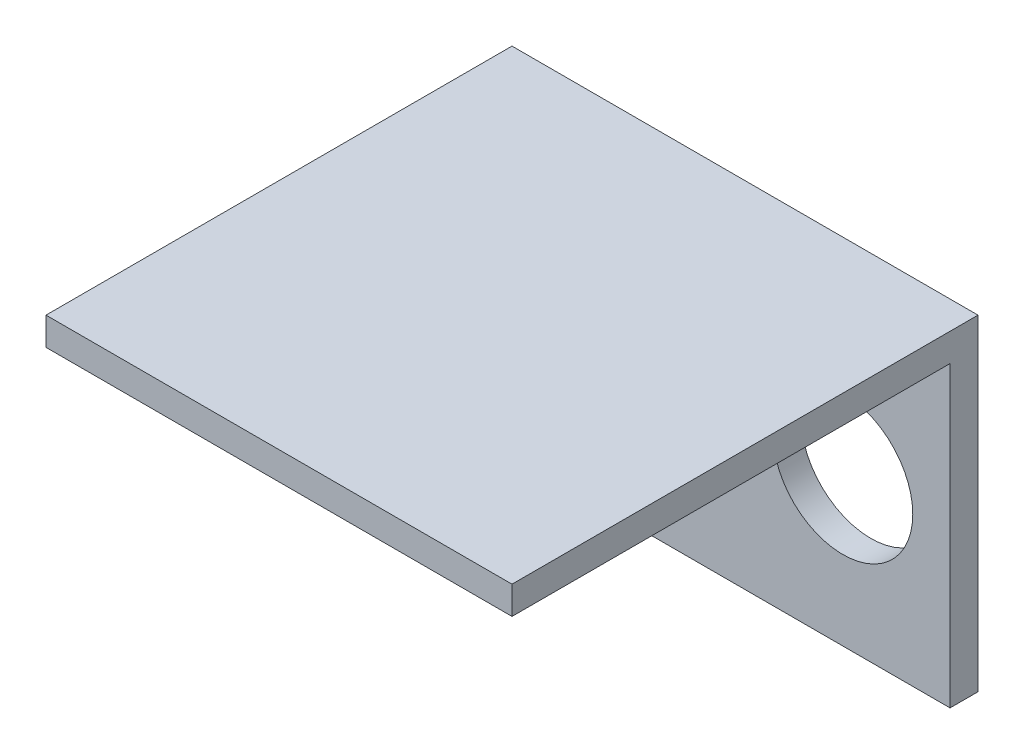
ISO-10303-21;
HEADER;
FILE_DESCRIPTION(('STEP AP214'),'2;1');
FILE_NAME('part.step','',(''),(''),'','','');
FILE_SCHEMA(('AUTOMOTIVE_DESIGN { 1 0 10303 214 1 1 1 1 }'));
ENDSEC;
DATA;
#1=APPLICATION_CONTEXT('core data for automotive mechanical design processes');
#2=APPLICATION_PROTOCOL_DEFINITION('international standard','automotive_design',2000,#1);
#3=PRODUCT_CONTEXT('',#1,'mechanical');
#4=PRODUCT('Part','Part','',(#3));
#5=PRODUCT_RELATED_PRODUCT_CATEGORY('part','',(#4));
#6=PRODUCT_DEFINITION_FORMATION('','',#4);
#7=PRODUCT_DEFINITION_CONTEXT('part definition',#1,'design');
#8=PRODUCT_DEFINITION('design','',#6,#7);
#9=PRODUCT_DEFINITION_SHAPE('','',#8);
#10=(LENGTH_UNIT() NAMED_UNIT(*) SI_UNIT(.MILLI.,.METRE.));
#11=(NAMED_UNIT(*) PLANE_ANGLE_UNIT() SI_UNIT($,.RADIAN.));
#12=(NAMED_UNIT(*) SI_UNIT($,.STERADIAN.) SOLID_ANGLE_UNIT());
#13=UNCERTAINTY_MEASURE_WITH_UNIT(LENGTH_MEASURE(1.E-05),#10,'distance_accuracy_value','');
#14=(GEOMETRIC_REPRESENTATION_CONTEXT(3) GLOBAL_UNCERTAINTY_ASSIGNED_CONTEXT((#13)) GLOBAL_UNIT_ASSIGNED_CONTEXT((#10,
#11,#12)) REPRESENTATION_CONTEXT('',''));
#15=CARTESIAN_POINT('',(0.,0.,0.));
#16=DIRECTION('',(0.,0.,1.));
#17=DIRECTION('',(1.,0.,0.));
#18=AXIS2_PLACEMENT_3D('',#15,#16,#17);
#19=CARTESIAN_POINT('',(-37.8760741653025,3.,39.1832679415775));
#20=DIRECTION('',(1.,0.,0.));
#21=DIRECTION('',(0.,0.,-1.));
#22=AXIS2_PLACEMENT_3D('',#19,#20,#21);
#23=PLANE('',#22);
#24=DIRECTION('',(0.,-1.,0.));
#25=VECTOR('',#24,1.);
#26=CARTESIAN_POINT('',(-37.8760741653025,3.,-10.8167320584225));
#27=LINE('',#26,#25);
#28=CARTESIAN_POINT('',(-37.8760741653025,3.,-10.8167320584225));
#29=VERTEX_POINT('',#28);
#30=CARTESIAN_POINT('',(-37.8760741653025,-32.,-10.8167320584225));
#31=VERTEX_POINT('',#30);
#32=EDGE_CURVE('E143',#29,#31,#27,.T.);
#33=ORIENTED_EDGE('',*,*,#32,.T.);
#34=DIRECTION('',(0.,0.,-1.));
#35=VECTOR('',#34,1.);
#36=CARTESIAN_POINT('',(-37.8760741653025,-32.,-10.8167320584225));
#37=LINE('',#36,#35);
#38=CARTESIAN_POINT('',(-37.8760741653025,-32.,-7.8167320584225));
#39=VERTEX_POINT('',#38);
#40=EDGE_CURVE('E111',#39,#31,#37,.T.);
#41=ORIENTED_EDGE('',*,*,#40,.F.);
#42=DIRECTION('',(0.,1.,0.));
#43=VECTOR('',#42,1.);
#44=CARTESIAN_POINT('',(-37.8760741653025,-32.,-7.8167320584225));
#45=LINE('',#44,#43);
#46=CARTESIAN_POINT('',(-37.8760741653025,0.,-7.8167320584225));
#47=VERTEX_POINT('',#46);
#48=EDGE_CURVE('E106',#39,#47,#45,.T.);
#49=ORIENTED_EDGE('',*,*,#48,.T.);
#50=DIRECTION('',(0.,0.,1.));
#51=VECTOR('',#50,1.);
#52=CARTESIAN_POINT('',(-37.8760741653025,0.,39.1832679415775));
#53=LINE('',#52,#51);
#54=CARTESIAN_POINT('',(-37.8760741653025,0.,39.1832679415775));
#55=VERTEX_POINT('',#54);
#56=EDGE_CURVE('E126',#47,#55,#53,.T.);
#57=ORIENTED_EDGE('',*,*,#56,.T.);
#58=DIRECTION('',(0.,-1.,0.));
#59=VECTOR('',#58,1.);
#60=CARTESIAN_POINT('',(-37.8760741653025,3.,39.1832679415775));
#61=LINE('',#60,#59);
#62=CARTESIAN_POINT('',(-37.8760741653025,3.,39.1832679415775));
#63=VERTEX_POINT('',#62);
#64=EDGE_CURVE('E11',#63,#55,#61,.T.);
#65=ORIENTED_EDGE('',*,*,#64,.F.);
#66=DIRECTION('',(0.,0.,1.));
#67=VECTOR('',#66,1.);
#68=CARTESIAN_POINT('',(-37.8760741653025,3.,39.1832679415775));
#69=LINE('',#68,#67);
#70=EDGE_CURVE('E134',#29,#63,#69,.T.);
#71=ORIENTED_EDGE('',*,*,#70,.F.);
#72=EDGE_LOOP('',(#33,#41,#49,#57,#65,#71));
#73=FACE_BOUND('',#72,.T.);
#74=ADVANCED_FACE('F39',(#73),#23,.F.);
#75=CARTESIAN_POINT('',(-37.8760741653025,3.,39.1832679415775));
#76=DIRECTION('',(0.,0.,-1.));
#77=DIRECTION('',(-1.,0.,0.));
#78=AXIS2_PLACEMENT_3D('',#75,#76,#77);
#79=PLANE('',#78);
#80=DIRECTION('',(1.,0.,0.));
#81=VECTOR('',#80,1.);
#82=CARTESIAN_POINT('',(-37.8760741653025,0.,39.1832679415775));
#83=LINE('',#82,#81);
#84=CARTESIAN_POINT('',(12.1239258346975,0.,39.1832679415775));
#85=VERTEX_POINT('',#84);
#86=EDGE_CURVE('E78',#55,#85,#83,.T.);
#87=ORIENTED_EDGE('',*,*,#86,.T.);
#88=DIRECTION('',(0.,-1.,0.));
#89=VECTOR('',#88,1.);
#90=CARTESIAN_POINT('',(12.1239258346975,3.,39.1832679415775));
#91=LINE('',#90,#89);
#92=CARTESIAN_POINT('',(12.1239258346975,3.,39.1832679415775));
#93=VERTEX_POINT('',#92);
#94=EDGE_CURVE('E47',#93,#85,#91,.T.);
#95=ORIENTED_EDGE('',*,*,#94,.F.);
#96=DIRECTION('',(1.,0.,0.));
#97=VECTOR('',#96,1.);
#98=CARTESIAN_POINT('',(-37.8760741653025,3.,39.1832679415775));
#99=LINE('',#98,#97);
#100=EDGE_CURVE('E83',#63,#93,#99,.T.);
#101=ORIENTED_EDGE('',*,*,#100,.F.);
#102=ORIENTED_EDGE('',*,*,#64,.T.);
#103=EDGE_LOOP('',(#87,#95,#101,#102));
#104=FACE_BOUND('',#103,.T.);
#105=ADVANCED_FACE('F157',(#104),#79,.F.);
#106=CARTESIAN_POINT('',(12.1239258346975,3.,39.1832679415775));
#107=DIRECTION('',(-1.,0.,0.));
#108=DIRECTION('',(0.,0.,1.));
#109=AXIS2_PLACEMENT_3D('',#106,#107,#108);
#110=PLANE('',#109);
#111=DIRECTION('',(0.,0.,-1.));
#112=VECTOR('',#111,1.);
#113=CARTESIAN_POINT('',(12.1239258346975,0.,39.1832679415775));
#114=LINE('',#113,#112);
#115=CARTESIAN_POINT('',(12.1239258346975,0.,-7.8167320584225));
#116=VERTEX_POINT('',#115);
#117=EDGE_CURVE('E124',#85,#116,#114,.T.);
#118=ORIENTED_EDGE('',*,*,#117,.T.);
#119=DIRECTION('',(0.,1.,0.));
#120=VECTOR('',#119,1.);
#121=CARTESIAN_POINT('',(12.1239258346975,-32.,-7.8167320584225));
#122=LINE('',#121,#120);
#123=CARTESIAN_POINT('',(12.1239258346975,-32.,-7.8167320584225));
#124=VERTEX_POINT('',#123);
#125=EDGE_CURVE('E104',#124,#116,#122,.T.);
#126=ORIENTED_EDGE('',*,*,#125,.F.);
#127=DIRECTION('',(0.,0.,1.));
#128=VECTOR('',#127,1.);
#129=CARTESIAN_POINT('',(12.1239258346975,-32.,-10.8167320584225));
#130=LINE('',#129,#128);
#131=CARTESIAN_POINT('',(12.1239258346975,-32.,-10.8167320584225));
#132=VERTEX_POINT('',#131);
#133=EDGE_CURVE('E112',#132,#124,#130,.T.);
#134=ORIENTED_EDGE('',*,*,#133,.F.);
#135=DIRECTION('',(0.,-1.,0.));
#136=VECTOR('',#135,1.);
#137=CARTESIAN_POINT('',(12.1239258346975,3.,-10.8167320584225));
#138=LINE('',#137,#136);
#139=CARTESIAN_POINT('',(12.1239258346975,3.,-10.8167320584225));
#140=VERTEX_POINT('',#139);
#141=EDGE_CURVE('E151',#140,#132,#138,.T.);
#142=ORIENTED_EDGE('',*,*,#141,.F.);
#143=DIRECTION('',(0.,0.,-1.));
#144=VECTOR('',#143,1.);
#145=CARTESIAN_POINT('',(12.1239258346975,3.,39.1832679415775));
#146=LINE('',#145,#144);
#147=EDGE_CURVE('E139',#93,#140,#146,.T.);
#148=ORIENTED_EDGE('',*,*,#147,.F.);
#149=ORIENTED_EDGE('',*,*,#94,.T.);
#150=EDGE_LOOP('',(#118,#126,#134,#142,#148,#149));
#151=FACE_BOUND('',#150,.T.);
#152=ADVANCED_FACE('F123',(#151),#110,.F.);
#153=CARTESIAN_POINT('',(-37.8760741653025,3.,-10.8167320584225));
#154=DIRECTION('',(0.,0.,1.));
#155=DIRECTION('',(1.,0.,0.));
#156=AXIS2_PLACEMENT_3D('',#153,#154,#155);
#157=PLANE('',#156);
#158=CARTESIAN_POINT('',(-26.3760741653025,-16.,-10.8167320584225));
#159=DIRECTION('',(0.,0.,1.));
#160=DIRECTION('',(1.,0.,0.));
#161=AXIS2_PLACEMENT_3D('',#158,#159,#160);
#162=CIRCLE('',#161,7.5);
#163=CARTESIAN_POINT('',(-18.8760741653025,-16.,-10.8167320584225));
#164=VERTEX_POINT('',#163);
#165=EDGE_CURVE('E165',#164,#164,#162,.T.);
#166=ORIENTED_EDGE('',*,*,#165,.T.);
#167=EDGE_LOOP('',(#166));
#168=FACE_BOUND('',#167,.T.);
#169=CARTESIAN_POINT('',(0.623925834697548,-16.,-10.8167320584225));
#170=DIRECTION('',(0.,0.,1.));
#171=DIRECTION('',(1.,0.,0.));
#172=AXIS2_PLACEMENT_3D('',#169,#170,#171);
#173=CIRCLE('',#172,7.5);
#174=CARTESIAN_POINT('',(8.12392583469755,-16.,-10.8167320584225));
#175=VERTEX_POINT('',#174);
#176=EDGE_CURVE('E174',#175,#175,#173,.T.);
#177=ORIENTED_EDGE('',*,*,#176,.T.);
#178=EDGE_LOOP('',(#177));
#179=FACE_BOUND('',#178,.T.);
#180=ORIENTED_EDGE('',*,*,#141,.T.);
#181=DIRECTION('',(1.,0.,0.));
#182=VECTOR('',#181,1.);
#183=CARTESIAN_POINT('',(12.1239258346975,-32.,-10.8167320584225));
#184=LINE('',#183,#182);
#185=EDGE_CURVE('E118',#31,#132,#184,.T.);
#186=ORIENTED_EDGE('',*,*,#185,.F.);
#187=ORIENTED_EDGE('',*,*,#32,.F.);
#188=DIRECTION('',(-1.,0.,0.));
#189=VECTOR('',#188,1.);
#190=CARTESIAN_POINT('',(-37.8760741653025,3.,-10.8167320584225));
#191=LINE('',#190,#189);
#192=EDGE_CURVE('E63',#140,#29,#191,.T.);
#193=ORIENTED_EDGE('',*,*,#192,.F.);
#194=EDGE_LOOP('',(#180,#186,#187,#193));
#195=FACE_BOUND('',#194,.T.);
#196=ADVANCED_FACE('F206',(#168,#179,#195),#157,.F.);
#197=CARTESIAN_POINT('',(0.,3.,0.));
#198=DIRECTION('',(0.,-1.,0.));
#199=DIRECTION('',(0.,0.,-1.));
#200=AXIS2_PLACEMENT_3D('',#197,#198,#199);
#201=PLANE('',#200);
#202=ORIENTED_EDGE('',*,*,#70,.T.);
#203=ORIENTED_EDGE('',*,*,#100,.T.);
#204=ORIENTED_EDGE('',*,*,#147,.T.);
#205=ORIENTED_EDGE('',*,*,#192,.T.);
#206=EDGE_LOOP('',(#202,#203,#204,#205));
#207=FACE_BOUND('',#206,.T.);
#208=ADVANCED_FACE('F195',(#207),#201,.F.);
#209=CARTESIAN_POINT('',(0.,0.,0.));
#210=DIRECTION('',(0.,-1.,0.));
#211=DIRECTION('',(0.,0.,-1.));
#212=AXIS2_PLACEMENT_3D('',#209,#210,#211);
#213=PLANE('',#212);
#214=DIRECTION('',(-1.,0.,0.));
#215=VECTOR('',#214,1.);
#216=CARTESIAN_POINT('',(12.1239258346975,0.,-7.8167320584225));
#217=LINE('',#216,#215);
#218=EDGE_CURVE('E54',#116,#47,#217,.T.);
#219=ORIENTED_EDGE('',*,*,#218,.F.);
#220=ORIENTED_EDGE('',*,*,#117,.F.);
#221=ORIENTED_EDGE('',*,*,#86,.F.);
#222=ORIENTED_EDGE('',*,*,#56,.F.);
#223=EDGE_LOOP('',(#219,#220,#221,#222));
#224=FACE_BOUND('',#223,.T.);
#225=ADVANCED_FACE('F155',(#224),#213,.T.);
#226=CARTESIAN_POINT('',(12.1239258346975,-32.,-7.8167320584225));
#227=DIRECTION('',(0.,0.,-1.));
#228=DIRECTION('',(-1.,0.,0.));
#229=AXIS2_PLACEMENT_3D('',#226,#227,#228);
#230=PLANE('',#229);
#231=CARTESIAN_POINT('',(-26.3760741653025,-16.,-7.8167320584225));
#232=DIRECTION('',(0.,0.,1.));
#233=DIRECTION('',(1.,0.,0.));
#234=AXIS2_PLACEMENT_3D('',#231,#232,#233);
#235=CIRCLE('',#234,7.5);
#236=CARTESIAN_POINT('',(-18.8760741653025,-16.,-7.8167320584225));
#237=VERTEX_POINT('',#236);
#238=EDGE_CURVE('E168',#237,#237,#235,.T.);
#239=ORIENTED_EDGE('',*,*,#238,.F.);
#240=EDGE_LOOP('',(#239));
#241=FACE_BOUND('',#240,.T.);
#242=CARTESIAN_POINT('',(0.623925834697548,-16.,-7.8167320584225));
#243=DIRECTION('',(0.,0.,1.));
#244=DIRECTION('',(1.,0.,0.));
#245=AXIS2_PLACEMENT_3D('',#242,#243,#244);
#246=CIRCLE('',#245,7.5);
#247=CARTESIAN_POINT('',(8.12392583469755,-16.,-7.8167320584225));
#248=VERTEX_POINT('',#247);
#249=EDGE_CURVE('E180',#248,#248,#246,.T.);
#250=ORIENTED_EDGE('',*,*,#249,.F.);
#251=EDGE_LOOP('',(#250));
#252=FACE_BOUND('',#251,.T.);
#253=ORIENTED_EDGE('',*,*,#218,.T.);
#254=ORIENTED_EDGE('',*,*,#48,.F.);
#255=DIRECTION('',(-1.,0.,0.));
#256=VECTOR('',#255,1.);
#257=CARTESIAN_POINT('',(12.1239258346975,-32.,-7.8167320584225));
#258=LINE('',#257,#256);
#259=EDGE_CURVE('E100',#124,#39,#258,.T.);
#260=ORIENTED_EDGE('',*,*,#259,.F.);
#261=ORIENTED_EDGE('',*,*,#125,.T.);
#262=EDGE_LOOP('',(#253,#254,#260,#261));
#263=FACE_BOUND('',#262,.T.);
#264=ADVANCED_FACE('F102',(#241,#252,#263),#230,.F.);
#265=CARTESIAN_POINT('',(0.,-32.,0.));
#266=DIRECTION('',(0.,-1.,0.));
#267=DIRECTION('',(0.,0.,-1.));
#268=AXIS2_PLACEMENT_3D('',#265,#266,#267);
#269=PLANE('',#268);
#270=ORIENTED_EDGE('',*,*,#133,.T.);
#271=ORIENTED_EDGE('',*,*,#259,.T.);
#272=ORIENTED_EDGE('',*,*,#40,.T.);
#273=ORIENTED_EDGE('',*,*,#185,.T.);
#274=EDGE_LOOP('',(#270,#271,#272,#273));
#275=FACE_BOUND('',#274,.T.);
#276=ADVANCED_FACE('F116',(#275),#269,.T.);
#277=CARTESIAN_POINT('',(0.623925834697548,-16.,-10.8167320584225));
#278=DIRECTION('',(0.,0.,1.));
#279=DIRECTION('',(1.,0.,0.));
#280=AXIS2_PLACEMENT_3D('',#277,#278,#279);
#281=CYLINDRICAL_SURFACE('',#280,7.5);
#282=ORIENTED_EDGE('',*,*,#176,.F.);
#283=EDGE_LOOP('',(#282));
#284=FACE_BOUND('',#283,.T.);
#285=ORIENTED_EDGE('',*,*,#249,.T.);
#286=EDGE_LOOP('',(#285));
#287=FACE_BOUND('',#286,.T.);
#288=ADVANCED_FACE('F185',(#284,#287),#281,.F.);
#289=CARTESIAN_POINT('',(-26.3760741653025,-16.,-10.8167320584225));
#290=DIRECTION('',(0.,0.,1.));
#291=DIRECTION('',(1.,0.,0.));
#292=AXIS2_PLACEMENT_3D('',#289,#290,#291);
#293=CYLINDRICAL_SURFACE('',#292,7.5);
#294=ORIENTED_EDGE('',*,*,#165,.F.);
#295=EDGE_LOOP('',(#294));
#296=FACE_BOUND('',#295,.T.);
#297=ORIENTED_EDGE('',*,*,#238,.T.);
#298=EDGE_LOOP('',(#297));
#299=FACE_BOUND('',#298,.T.);
#300=ADVANCED_FACE('F248',(#296,#299),#293,.F.);
#301=CLOSED_SHELL('',(#74,#105,#152,#196,#208,#225,#264,#276,#288,#300));
#302=MANIFOLD_SOLID_BREP('B2',#301);
#303=ADVANCED_BREP_SHAPE_REPRESENTATION('',(#18,#302),#14);
#304=SHAPE_DEFINITION_REPRESENTATION(#9,#303);
ENDSEC;
END-ISO-10303-21;
